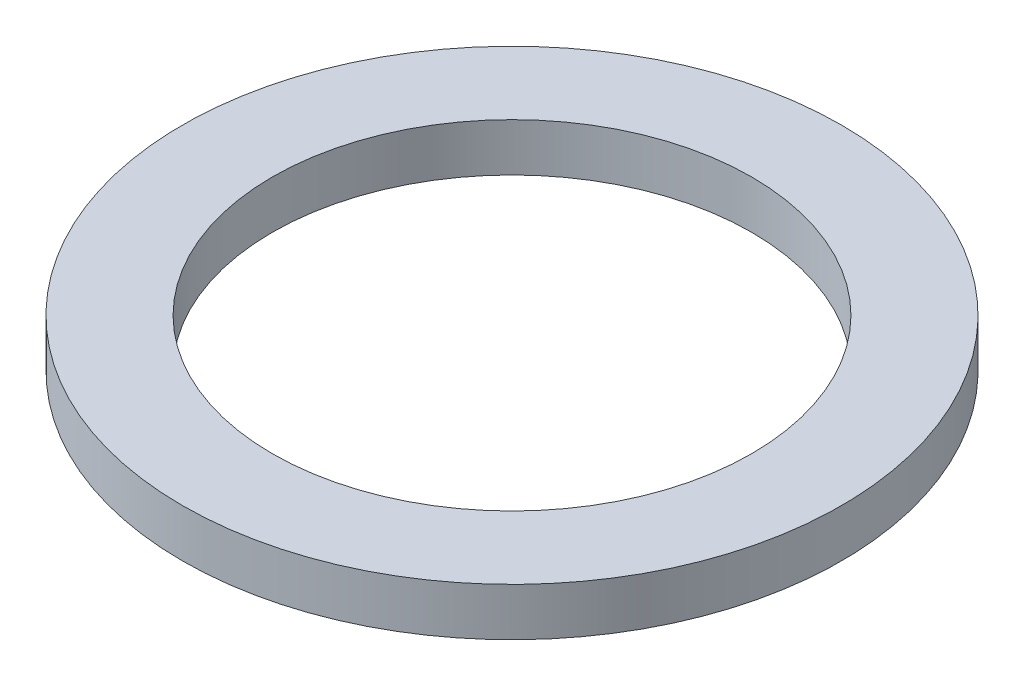
ISO-10303-21;
HEADER;
FILE_DESCRIPTION(('STEP AP214'),'2;1');
FILE_NAME('part.step','',(''),(''),'','','');
FILE_SCHEMA(('AUTOMOTIVE_DESIGN { 1 0 10303 214 1 1 1 1 }'));
ENDSEC;
DATA;
#1=APPLICATION_CONTEXT('core data for automotive mechanical design processes');
#2=APPLICATION_PROTOCOL_DEFINITION('international standard','automotive_design',2000,#1);
#3=PRODUCT_CONTEXT('',#1,'mechanical');
#4=PRODUCT('Part','Part','',(#3));
#5=PRODUCT_RELATED_PRODUCT_CATEGORY('part','',(#4));
#6=PRODUCT_DEFINITION_FORMATION('','',#4);
#7=PRODUCT_DEFINITION_CONTEXT('part definition',#1,'design');
#8=PRODUCT_DEFINITION('design','',#6,#7);
#9=PRODUCT_DEFINITION_SHAPE('','',#8);
#10=(LENGTH_UNIT() NAMED_UNIT(*) SI_UNIT(.MILLI.,.METRE.));
#11=(NAMED_UNIT(*) PLANE_ANGLE_UNIT() SI_UNIT($,.RADIAN.));
#12=(NAMED_UNIT(*) SI_UNIT($,.STERADIAN.) SOLID_ANGLE_UNIT());
#13=UNCERTAINTY_MEASURE_WITH_UNIT(LENGTH_MEASURE(1.E-05),#10,'distance_accuracy_value','');
#14=(GEOMETRIC_REPRESENTATION_CONTEXT(3) GLOBAL_UNCERTAINTY_ASSIGNED_CONTEXT((#13)) GLOBAL_UNIT_ASSIGNED_CONTEXT((#10,
#11,#12)) REPRESENTATION_CONTEXT('',''));
#15=CARTESIAN_POINT('',(0.,0.,0.));
#16=DIRECTION('',(0.,0.,1.));
#17=DIRECTION('',(1.,0.,0.));
#18=AXIS2_PLACEMENT_3D('',#15,#16,#17);
#19=CARTESIAN_POINT('',(0.,2.,0.));
#20=DIRECTION('',(0.,1.,0.));
#21=DIRECTION('',(0.,0.,1.));
#22=AXIS2_PLACEMENT_3D('',#19,#20,#21);
#23=PLANE('',#22);
#24=CARTESIAN_POINT('',(0.,2.,0.));
#25=DIRECTION('',(0.,1.,0.));
#26=DIRECTION('',(0.,0.,1.));
#27=AXIS2_PLACEMENT_3D('',#24,#25,#26);
#28=CIRCLE('',#27,13.75);
#29=CARTESIAN_POINT('',(0.,2.,13.75));
#30=VERTEX_POINT('',#29);
#31=EDGE_CURVE('E10',#30,#30,#28,.T.);
#32=ORIENTED_EDGE('',*,*,#31,.T.);
#33=EDGE_LOOP('',(#32));
#34=FACE_BOUND('',#33,.T.);
#35=CARTESIAN_POINT('',(0.,2.,0.));
#36=DIRECTION('',(0.,1.,0.));
#37=DIRECTION('',(0.,0.,1.));
#38=AXIS2_PLACEMENT_3D('',#35,#36,#37);
#39=CIRCLE('',#38,10.);
#40=CARTESIAN_POINT('',(0.,2.,10.));
#41=VERTEX_POINT('',#40);
#42=EDGE_CURVE('E42',#41,#41,#39,.T.);
#43=ORIENTED_EDGE('',*,*,#42,.F.);
#44=EDGE_LOOP('',(#43));
#45=FACE_BOUND('',#44,.T.);
#46=ADVANCED_FACE('F31',(#34,#45),#23,.T.);
#47=CARTESIAN_POINT('',(0.,0.,0.));
#48=DIRECTION('',(0.,1.,0.));
#49=DIRECTION('',(0.,0.,1.));
#50=AXIS2_PLACEMENT_3D('',#47,#48,#49);
#51=PLANE('',#50);
#52=CARTESIAN_POINT('',(0.,0.,0.));
#53=DIRECTION('',(0.,1.,0.));
#54=DIRECTION('',(0.,0.,1.));
#55=AXIS2_PLACEMENT_3D('',#52,#53,#54);
#56=CIRCLE('',#55,13.75);
#57=CARTESIAN_POINT('',(0.,0.,13.75));
#58=VERTEX_POINT('',#57);
#59=EDGE_CURVE('E35',#58,#58,#56,.T.);
#60=ORIENTED_EDGE('',*,*,#59,.F.);
#61=EDGE_LOOP('',(#60));
#62=FACE_BOUND('',#61,.T.);
#63=CARTESIAN_POINT('',(0.,0.,0.));
#64=DIRECTION('',(0.,1.,0.));
#65=DIRECTION('',(0.,0.,1.));
#66=AXIS2_PLACEMENT_3D('',#63,#64,#65);
#67=CIRCLE('',#66,10.);
#68=CARTESIAN_POINT('',(0.,0.,10.));
#69=VERTEX_POINT('',#68);
#70=EDGE_CURVE('E44',#69,#69,#67,.T.);
#71=ORIENTED_EDGE('',*,*,#70,.T.);
#72=EDGE_LOOP('',(#71));
#73=FACE_BOUND('',#72,.T.);
#74=ADVANCED_FACE('F54',(#62,#73),#51,.F.);
#75=CARTESIAN_POINT('',(0.,2.,0.));
#76=DIRECTION('',(0.,-1.,0.));
#77=DIRECTION('',(0.,0.,-1.));
#78=AXIS2_PLACEMENT_3D('',#75,#76,#77);
#79=CYLINDRICAL_SURFACE('',#78,13.75);
#80=ORIENTED_EDGE('',*,*,#31,.F.);
#81=EDGE_LOOP('',(#80));
#82=FACE_BOUND('',#81,.T.);
#83=ORIENTED_EDGE('',*,*,#59,.T.);
#84=EDGE_LOOP('',(#83));
#85=FACE_BOUND('',#84,.T.);
#86=ADVANCED_FACE('F33',(#82,#85),#79,.T.);
#87=CARTESIAN_POINT('',(0.,2.,0.));
#88=DIRECTION('',(0.,-1.,0.));
#89=DIRECTION('',(0.,0.,-1.));
#90=AXIS2_PLACEMENT_3D('',#87,#88,#89);
#91=CYLINDRICAL_SURFACE('',#90,10.);
#92=ORIENTED_EDGE('',*,*,#42,.T.);
#93=EDGE_LOOP('',(#92));
#94=FACE_BOUND('',#93,.T.);
#95=ORIENTED_EDGE('',*,*,#70,.F.);
#96=EDGE_LOOP('',(#95));
#97=FACE_BOUND('',#96,.T.);
#98=ADVANCED_FACE('F50',(#94,#97),#91,.F.);
#99=CLOSED_SHELL('',(#46,#74,#86,#98));
#100=MANIFOLD_SOLID_BREP('B2',#99);
#101=ADVANCED_BREP_SHAPE_REPRESENTATION('',(#18,#100),#14);
#102=SHAPE_DEFINITION_REPRESENTATION(#9,#101);
ENDSEC;
END-ISO-10303-21;
